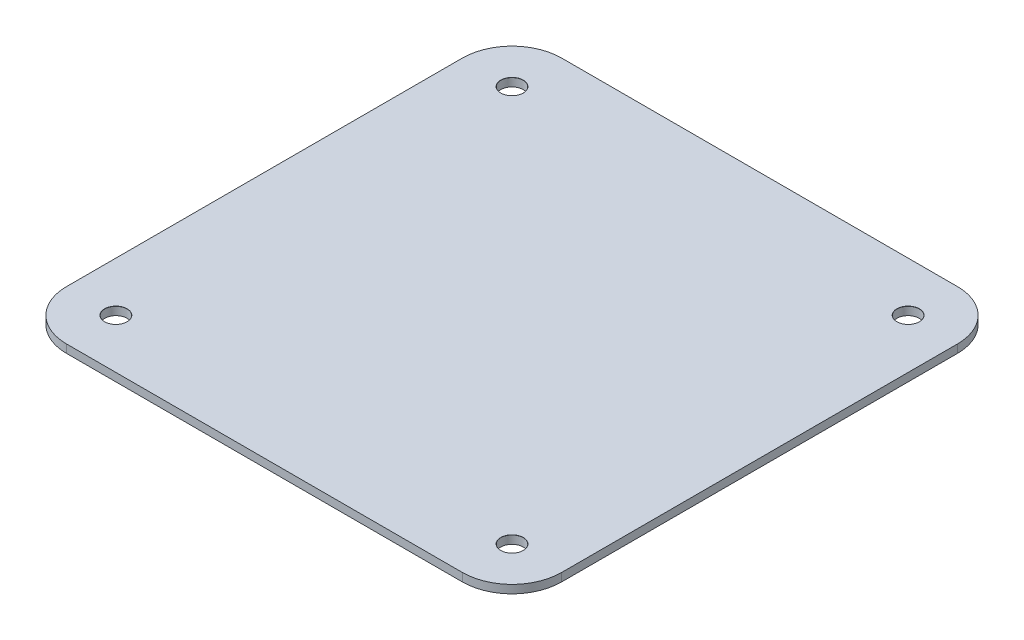
ISO-10303-21;
HEADER;
FILE_DESCRIPTION(('STEP AP214'),'2;1');
FILE_NAME('part.step','',(''),(''),'','','');
FILE_SCHEMA(('AUTOMOTIVE_DESIGN { 1 0 10303 214 1 1 1 1 }'));
ENDSEC;
DATA;
#1=APPLICATION_CONTEXT('core data for automotive mechanical design processes');
#2=APPLICATION_PROTOCOL_DEFINITION('international standard','automotive_design',2000,#1);
#3=PRODUCT_CONTEXT('',#1,'mechanical');
#4=PRODUCT('Part','Part','',(#3));
#5=PRODUCT_RELATED_PRODUCT_CATEGORY('part','',(#4));
#6=PRODUCT_DEFINITION_FORMATION('','',#4);
#7=PRODUCT_DEFINITION_CONTEXT('part definition',#1,'design');
#8=PRODUCT_DEFINITION('design','',#6,#7);
#9=PRODUCT_DEFINITION_SHAPE('','',#8);
#10=(LENGTH_UNIT() NAMED_UNIT(*) SI_UNIT(.MILLI.,.METRE.));
#11=(NAMED_UNIT(*) PLANE_ANGLE_UNIT() SI_UNIT($,.RADIAN.));
#12=(NAMED_UNIT(*) SI_UNIT($,.STERADIAN.) SOLID_ANGLE_UNIT());
#13=UNCERTAINTY_MEASURE_WITH_UNIT(LENGTH_MEASURE(1.E-05),#10,'distance_accuracy_value','');
#14=(GEOMETRIC_REPRESENTATION_CONTEXT(3) GLOBAL_UNCERTAINTY_ASSIGNED_CONTEXT((#13)) GLOBAL_UNIT_ASSIGNED_CONTEXT((#10,
#11,#12)) REPRESENTATION_CONTEXT('',''));
#15=CARTESIAN_POINT('',(0.,0.,0.));
#16=DIRECTION('',(0.,0.,1.));
#17=DIRECTION('',(1.,0.,0.));
#18=AXIS2_PLACEMENT_3D('',#15,#16,#17);
#19=CARTESIAN_POINT('',(50.,1.66,-50.));
#20=DIRECTION('',(-1.,0.,0.));
#21=DIRECTION('',(0.,0.,1.));
#22=AXIS2_PLACEMENT_3D('',#19,#20,#21);
#23=PLANE('',#22);
#24=DIRECTION('',(0.,0.,-1.));
#25=VECTOR('',#24,1.);
#26=CARTESIAN_POINT('',(50.,1.66,-50.));
#27=LINE('',#26,#25);
#28=CARTESIAN_POINT('',(50.,1.66,40.));
#29=VERTEX_POINT('',#28);
#30=CARTESIAN_POINT('',(50.,1.66,-40.));
#31=VERTEX_POINT('',#30);
#32=EDGE_CURVE('E131',#29,#31,#27,.T.);
#33=ORIENTED_EDGE('',*,*,#32,.F.);
#34=DIRECTION('',(0.,-1.,0.));
#35=VECTOR('',#34,1.);
#36=CARTESIAN_POINT('',(50.,1.66,40.));
#37=LINE('',#36,#35);
#38=CARTESIAN_POINT('',(50.,0.,40.));
#39=VERTEX_POINT('',#38);
#40=EDGE_CURVE('E116',#29,#39,#37,.T.);
#41=ORIENTED_EDGE('',*,*,#40,.T.);
#42=DIRECTION('',(0.,0.,-1.));
#43=VECTOR('',#42,1.);
#44=CARTESIAN_POINT('',(50.,0.,-50.));
#45=LINE('',#44,#43);
#46=CARTESIAN_POINT('',(50.,0.,-40.));
#47=VERTEX_POINT('',#46);
#48=EDGE_CURVE('E128',#39,#47,#45,.T.);
#49=ORIENTED_EDGE('',*,*,#48,.T.);
#50=DIRECTION('',(0.,-1.,0.));
#51=VECTOR('',#50,1.);
#52=CARTESIAN_POINT('',(50.,1.66,-40.));
#53=LINE('',#52,#51);
#54=EDGE_CURVE('E133',#47,#31,#53,.F.);
#55=ORIENTED_EDGE('',*,*,#54,.T.);
#56=EDGE_LOOP('',(#33,#41,#49,#55));
#57=FACE_BOUND('',#56,.T.);
#58=ADVANCED_FACE('F44',(#57),#23,.F.);
#59=CARTESIAN_POINT('',(-50.,1.66,-50.));
#60=DIRECTION('',(0.,0.,1.));
#61=DIRECTION('',(1.,0.,0.));
#62=AXIS2_PLACEMENT_3D('',#59,#60,#61);
#63=PLANE('',#62);
#64=DIRECTION('',(-1.,0.,0.));
#65=VECTOR('',#64,1.);
#66=CARTESIAN_POINT('',(-50.,0.,-50.));
#67=LINE('',#66,#65);
#68=CARTESIAN_POINT('',(40.,0.,-50.));
#69=VERTEX_POINT('',#68);
#70=CARTESIAN_POINT('',(-40.,0.,-50.));
#71=VERTEX_POINT('',#70);
#72=EDGE_CURVE('E138',#69,#71,#67,.T.);
#73=ORIENTED_EDGE('',*,*,#72,.T.);
#74=DIRECTION('',(0.,-1.,0.));
#75=VECTOR('',#74,1.);
#76=CARTESIAN_POINT('',(-40.,1.66,-50.));
#77=LINE('',#76,#75);
#78=CARTESIAN_POINT('',(-40.,1.66,-50.));
#79=VERTEX_POINT('',#78);
#80=EDGE_CURVE('E12',#71,#79,#77,.F.);
#81=ORIENTED_EDGE('',*,*,#80,.T.);
#82=DIRECTION('',(-1.,0.,0.));
#83=VECTOR('',#82,1.);
#84=CARTESIAN_POINT('',(-50.,1.66,-50.));
#85=LINE('',#84,#83);
#86=CARTESIAN_POINT('',(40.,1.66,-50.));
#87=VERTEX_POINT('',#86);
#88=EDGE_CURVE('E178',#87,#79,#85,.T.);
#89=ORIENTED_EDGE('',*,*,#88,.F.);
#90=DIRECTION('',(0.,-1.,0.));
#91=VECTOR('',#90,1.);
#92=CARTESIAN_POINT('',(40.,1.66,-50.));
#93=LINE('',#92,#91);
#94=EDGE_CURVE('E53',#87,#69,#93,.T.);
#95=ORIENTED_EDGE('',*,*,#94,.T.);
#96=EDGE_LOOP('',(#73,#81,#89,#95));
#97=FACE_BOUND('',#96,.T.);
#98=ADVANCED_FACE('F244',(#97),#63,.F.);
#99=CARTESIAN_POINT('',(-50.,1.66,-50.));
#100=DIRECTION('',(1.,0.,0.));
#101=DIRECTION('',(0.,0.,-1.));
#102=AXIS2_PLACEMENT_3D('',#99,#100,#101);
#103=PLANE('',#102);
#104=DIRECTION('',(0.,0.,1.));
#105=VECTOR('',#104,1.);
#106=CARTESIAN_POINT('',(-50.,1.66,-50.));
#107=LINE('',#106,#105);
#108=CARTESIAN_POINT('',(-50.,1.66,-40.));
#109=VERTEX_POINT('',#108);
#110=CARTESIAN_POINT('',(-50.,1.66,40.));
#111=VERTEX_POINT('',#110);
#112=EDGE_CURVE('E181',#109,#111,#107,.T.);
#113=ORIENTED_EDGE('',*,*,#112,.F.);
#114=DIRECTION('',(0.,-1.,0.));
#115=VECTOR('',#114,1.);
#116=CARTESIAN_POINT('',(-50.,1.66,-40.));
#117=LINE('',#116,#115);
#118=CARTESIAN_POINT('',(-50.,0.,-40.));
#119=VERTEX_POINT('',#118);
#120=EDGE_CURVE('E198',#109,#119,#117,.T.);
#121=ORIENTED_EDGE('',*,*,#120,.T.);
#122=DIRECTION('',(0.,0.,1.));
#123=VECTOR('',#122,1.);
#124=CARTESIAN_POINT('',(-50.,0.,-50.));
#125=LINE('',#124,#123);
#126=CARTESIAN_POINT('',(-50.,0.,40.));
#127=VERTEX_POINT('',#126);
#128=EDGE_CURVE('E142',#119,#127,#125,.T.);
#129=ORIENTED_EDGE('',*,*,#128,.T.);
#130=DIRECTION('',(0.,-1.,0.));
#131=VECTOR('',#130,1.);
#132=CARTESIAN_POINT('',(-50.,1.66,40.));
#133=LINE('',#132,#131);
#134=EDGE_CURVE('E61',#127,#111,#133,.F.);
#135=ORIENTED_EDGE('',*,*,#134,.T.);
#136=EDGE_LOOP('',(#113,#121,#129,#135));
#137=FACE_BOUND('',#136,.T.);
#138=ADVANCED_FACE('F238',(#137),#103,.F.);
#139=CARTESIAN_POINT('',(-50.,1.66,50.));
#140=DIRECTION('',(0.,0.,-1.));
#141=DIRECTION('',(-1.,0.,0.));
#142=AXIS2_PLACEMENT_3D('',#139,#140,#141);
#143=PLANE('',#142);
#144=DIRECTION('',(1.,0.,0.));
#145=VECTOR('',#144,1.);
#146=CARTESIAN_POINT('',(-50.,0.,50.));
#147=LINE('',#146,#145);
#148=CARTESIAN_POINT('',(-40.,0.,50.));
#149=VERTEX_POINT('',#148);
#150=CARTESIAN_POINT('',(40.,0.,50.));
#151=VERTEX_POINT('',#150);
#152=EDGE_CURVE('E153',#149,#151,#147,.T.);
#153=ORIENTED_EDGE('',*,*,#152,.T.);
#154=DIRECTION('',(0.,-1.,0.));
#155=VECTOR('',#154,1.);
#156=CARTESIAN_POINT('',(40.,1.66,50.));
#157=LINE('',#156,#155);
#158=CARTESIAN_POINT('',(40.,1.66,50.));
#159=VERTEX_POINT('',#158);
#160=EDGE_CURVE('E117',#151,#159,#157,.F.);
#161=ORIENTED_EDGE('',*,*,#160,.T.);
#162=DIRECTION('',(1.,0.,0.));
#163=VECTOR('',#162,1.);
#164=CARTESIAN_POINT('',(-50.,1.66,50.));
#165=LINE('',#164,#163);
#166=CARTESIAN_POINT('',(-40.,1.66,50.));
#167=VERTEX_POINT('',#166);
#168=EDGE_CURVE('E148',#167,#159,#165,.T.);
#169=ORIENTED_EDGE('',*,*,#168,.F.);
#170=DIRECTION('',(0.,-1.,0.));
#171=VECTOR('',#170,1.);
#172=CARTESIAN_POINT('',(-40.,1.66,50.));
#173=LINE('',#172,#171);
#174=EDGE_CURVE('E122',#167,#149,#173,.T.);
#175=ORIENTED_EDGE('',*,*,#174,.T.);
#176=EDGE_LOOP('',(#153,#161,#169,#175));
#177=FACE_BOUND('',#176,.T.);
#178=ADVANCED_FACE('F228',(#177),#143,.F.);
#179=CARTESIAN_POINT('',(0.,1.66,0.));
#180=DIRECTION('',(0.,1.,0.));
#181=DIRECTION('',(0.,0.,1.));
#182=AXIS2_PLACEMENT_3D('',#179,#180,#181);
#183=PLANE('',#182);
#184=CARTESIAN_POINT('',(-40.,1.66,-40.));
#185=DIRECTION('',(0.,1.,0.));
#186=DIRECTION('',(0.,0.,1.));
#187=AXIS2_PLACEMENT_3D('',#184,#185,#186);
#188=CIRCLE('',#187,2.275);
#189=CARTESIAN_POINT('',(-40.,1.66,-37.725));
#190=VERTEX_POINT('',#189);
#191=EDGE_CURVE('E297',#190,#190,#188,.T.);
#192=ORIENTED_EDGE('',*,*,#191,.F.);
#193=EDGE_LOOP('',(#192));
#194=FACE_BOUND('',#193,.T.);
#195=CARTESIAN_POINT('',(-40.,1.66,40.));
#196=DIRECTION('',(0.,1.,0.));
#197=DIRECTION('',(0.,0.,1.));
#198=AXIS2_PLACEMENT_3D('',#195,#196,#197);
#199=CIRCLE('',#198,2.275);
#200=CARTESIAN_POINT('',(-40.,1.66,42.275));
#201=VERTEX_POINT('',#200);
#202=EDGE_CURVE('E284',#201,#201,#199,.T.);
#203=ORIENTED_EDGE('',*,*,#202,.F.);
#204=EDGE_LOOP('',(#203));
#205=FACE_BOUND('',#204,.T.);
#206=CARTESIAN_POINT('',(40.,1.66,40.));
#207=DIRECTION('',(0.,1.,0.));
#208=DIRECTION('',(0.,0.,1.));
#209=AXIS2_PLACEMENT_3D('',#206,#207,#208);
#210=CIRCLE('',#209,2.275);
#211=CARTESIAN_POINT('',(40.,1.66,42.275));
#212=VERTEX_POINT('',#211);
#213=EDGE_CURVE('E277',#212,#212,#210,.T.);
#214=ORIENTED_EDGE('',*,*,#213,.F.);
#215=EDGE_LOOP('',(#214));
#216=FACE_BOUND('',#215,.T.);
#217=CARTESIAN_POINT('',(40.,1.66,-40.));
#218=DIRECTION('',(0.,1.,0.));
#219=DIRECTION('',(0.,0.,1.));
#220=AXIS2_PLACEMENT_3D('',#217,#218,#219);
#221=CIRCLE('',#220,2.275);
#222=CARTESIAN_POINT('',(40.,1.66,-37.725));
#223=VERTEX_POINT('',#222);
#224=EDGE_CURVE('E208',#223,#223,#221,.T.);
#225=ORIENTED_EDGE('',*,*,#224,.F.);
#226=EDGE_LOOP('',(#225));
#227=FACE_BOUND('',#226,.T.);
#228=ORIENTED_EDGE('',*,*,#168,.T.);
#229=CARTESIAN_POINT('',(40.,1.66,40.));
#230=DIRECTION('',(0.,1.,0.));
#231=DIRECTION('',(0.,0.,1.));
#232=AXIS2_PLACEMENT_3D('',#229,#230,#231);
#233=CIRCLE('',#232,10.);
#234=EDGE_CURVE('E194',#159,#29,#233,.T.);
#235=ORIENTED_EDGE('',*,*,#234,.T.);
#236=ORIENTED_EDGE('',*,*,#32,.T.);
#237=CARTESIAN_POINT('',(40.,1.66,-40.));
#238=DIRECTION('',(0.,1.,0.));
#239=DIRECTION('',(0.,0.,1.));
#240=AXIS2_PLACEMENT_3D('',#237,#238,#239);
#241=CIRCLE('',#240,10.);
#242=EDGE_CURVE('E165',#31,#87,#241,.T.);
#243=ORIENTED_EDGE('',*,*,#242,.T.);
#244=ORIENTED_EDGE('',*,*,#88,.T.);
#245=CARTESIAN_POINT('',(-40.,1.66,-40.));
#246=DIRECTION('',(0.,1.,0.));
#247=DIRECTION('',(0.,0.,1.));
#248=AXIS2_PLACEMENT_3D('',#245,#246,#247);
#249=CIRCLE('',#248,10.);
#250=EDGE_CURVE('E68',#79,#109,#249,.T.);
#251=ORIENTED_EDGE('',*,*,#250,.T.);
#252=ORIENTED_EDGE('',*,*,#112,.T.);
#253=CARTESIAN_POINT('',(-40.,1.66,40.));
#254=DIRECTION('',(0.,1.,0.));
#255=DIRECTION('',(0.,0.,1.));
#256=AXIS2_PLACEMENT_3D('',#253,#254,#255);
#257=CIRCLE('',#256,10.);
#258=EDGE_CURVE('E161',#111,#167,#257,.T.);
#259=ORIENTED_EDGE('',*,*,#258,.T.);
#260=EDGE_LOOP('',(#228,#235,#236,#243,#244,#251,#252,#259));
#261=FACE_BOUND('',#260,.T.);
#262=ADVANCED_FACE('F193',(#194,#205,#216,#227,#261),#183,.T.);
#263=CARTESIAN_POINT('',(0.,0.,0.));
#264=DIRECTION('',(0.,1.,0.));
#265=DIRECTION('',(0.,0.,1.));
#266=AXIS2_PLACEMENT_3D('',#263,#264,#265);
#267=PLANE('',#266);
#268=CARTESIAN_POINT('',(-40.,0.,-40.));
#269=DIRECTION('',(0.,1.,0.));
#270=DIRECTION('',(0.,0.,1.));
#271=AXIS2_PLACEMENT_3D('',#268,#269,#270);
#272=CIRCLE('',#271,2.25);
#273=CARTESIAN_POINT('',(-40.,0.,-37.75));
#274=VERTEX_POINT('',#273);
#275=EDGE_CURVE('E48',#274,#274,#272,.T.);
#276=ORIENTED_EDGE('',*,*,#275,.T.);
#277=EDGE_LOOP('',(#276));
#278=FACE_BOUND('',#277,.T.);
#279=CARTESIAN_POINT('',(-40.,0.,40.));
#280=DIRECTION('',(0.,1.,0.));
#281=DIRECTION('',(0.,0.,1.));
#282=AXIS2_PLACEMENT_3D('',#279,#280,#281);
#283=CIRCLE('',#282,2.25);
#284=CARTESIAN_POINT('',(-40.,0.,42.25));
#285=VERTEX_POINT('',#284);
#286=EDGE_CURVE('E275',#285,#285,#283,.T.);
#287=ORIENTED_EDGE('',*,*,#286,.T.);
#288=EDGE_LOOP('',(#287));
#289=FACE_BOUND('',#288,.T.);
#290=CARTESIAN_POINT('',(40.,0.,40.));
#291=DIRECTION('',(0.,1.,0.));
#292=DIRECTION('',(0.,0.,1.));
#293=AXIS2_PLACEMENT_3D('',#290,#291,#292);
#294=CIRCLE('',#293,2.25);
#295=CARTESIAN_POINT('',(40.,0.,42.25));
#296=VERTEX_POINT('',#295);
#297=EDGE_CURVE('E212',#296,#296,#294,.T.);
#298=ORIENTED_EDGE('',*,*,#297,.T.);
#299=EDGE_LOOP('',(#298));
#300=FACE_BOUND('',#299,.T.);
#301=CARTESIAN_POINT('',(40.,0.,-40.));
#302=DIRECTION('',(0.,1.,0.));
#303=DIRECTION('',(0.,0.,1.));
#304=AXIS2_PLACEMENT_3D('',#301,#302,#303);
#305=CIRCLE('',#304,2.25);
#306=CARTESIAN_POINT('',(40.,0.,-37.75));
#307=VERTEX_POINT('',#306);
#308=EDGE_CURVE('E139',#307,#307,#305,.T.);
#309=ORIENTED_EDGE('',*,*,#308,.T.);
#310=EDGE_LOOP('',(#309));
#311=FACE_BOUND('',#310,.T.);
#312=ORIENTED_EDGE('',*,*,#48,.F.);
#313=CARTESIAN_POINT('',(40.,0.,40.));
#314=DIRECTION('',(0.,1.,0.));
#315=DIRECTION('',(0.,0.,1.));
#316=AXIS2_PLACEMENT_3D('',#313,#314,#315);
#317=CIRCLE('',#316,10.);
#318=EDGE_CURVE('E112',#39,#151,#317,.F.);
#319=ORIENTED_EDGE('',*,*,#318,.T.);
#320=ORIENTED_EDGE('',*,*,#152,.F.);
#321=CARTESIAN_POINT('',(-40.,0.,40.));
#322=DIRECTION('',(0.,1.,0.));
#323=DIRECTION('',(0.,0.,1.));
#324=AXIS2_PLACEMENT_3D('',#321,#322,#323);
#325=CIRCLE('',#324,10.);
#326=EDGE_CURVE('E132',#149,#127,#325,.F.);
#327=ORIENTED_EDGE('',*,*,#326,.T.);
#328=ORIENTED_EDGE('',*,*,#128,.F.);
#329=CARTESIAN_POINT('',(-40.,0.,-40.));
#330=DIRECTION('',(0.,1.,0.));
#331=DIRECTION('',(0.,0.,1.));
#332=AXIS2_PLACEMENT_3D('',#329,#330,#331);
#333=CIRCLE('',#332,10.);
#334=EDGE_CURVE('E123',#119,#71,#333,.F.);
#335=ORIENTED_EDGE('',*,*,#334,.T.);
#336=ORIENTED_EDGE('',*,*,#72,.F.);
#337=CARTESIAN_POINT('',(40.,0.,-40.));
#338=DIRECTION('',(0.,1.,0.));
#339=DIRECTION('',(0.,0.,1.));
#340=AXIS2_PLACEMENT_3D('',#337,#338,#339);
#341=CIRCLE('',#340,10.);
#342=EDGE_CURVE('E137',#69,#47,#341,.F.);
#343=ORIENTED_EDGE('',*,*,#342,.T.);
#344=EDGE_LOOP('',(#312,#319,#320,#327,#328,#335,#336,#343));
#345=FACE_BOUND('',#344,.T.);
#346=ADVANCED_FACE('F135',(#278,#289,#300,#311,#345),#267,.F.);
#347=CARTESIAN_POINT('',(40.,1.66,40.));
#348=DIRECTION('',(0.,-1.,0.));
#349=DIRECTION('',(0.,0.,-1.));
#350=AXIS2_PLACEMENT_3D('',#347,#348,#349);
#351=CYLINDRICAL_SURFACE('',#350,10.);
#352=ORIENTED_EDGE('',*,*,#234,.F.);
#353=ORIENTED_EDGE('',*,*,#160,.F.);
#354=ORIENTED_EDGE('',*,*,#318,.F.);
#355=ORIENTED_EDGE('',*,*,#40,.F.);
#356=EDGE_LOOP('',(#352,#353,#354,#355));
#357=FACE_BOUND('',#356,.T.);
#358=ADVANCED_FACE('F115',(#357),#351,.T.);
#359=CARTESIAN_POINT('',(-40.,1.66,-40.));
#360=DIRECTION('',(0.,-1.,0.));
#361=DIRECTION('',(0.,0.,-1.));
#362=AXIS2_PLACEMENT_3D('',#359,#360,#361);
#363=CYLINDRICAL_SURFACE('',#362,10.);
#364=ORIENTED_EDGE('',*,*,#250,.F.);
#365=ORIENTED_EDGE('',*,*,#80,.F.);
#366=ORIENTED_EDGE('',*,*,#334,.F.);
#367=ORIENTED_EDGE('',*,*,#120,.F.);
#368=EDGE_LOOP('',(#364,#365,#366,#367));
#369=FACE_BOUND('',#368,.T.);
#370=ADVANCED_FACE('F255',(#369),#363,.T.);
#371=CARTESIAN_POINT('',(40.,1.66,-40.));
#372=DIRECTION('',(0.,-1.,0.));
#373=DIRECTION('',(0.,0.,-1.));
#374=AXIS2_PLACEMENT_3D('',#371,#372,#373);
#375=CYLINDRICAL_SURFACE('',#374,10.);
#376=ORIENTED_EDGE('',*,*,#242,.F.);
#377=ORIENTED_EDGE('',*,*,#54,.F.);
#378=ORIENTED_EDGE('',*,*,#342,.F.);
#379=ORIENTED_EDGE('',*,*,#94,.F.);
#380=EDGE_LOOP('',(#376,#377,#378,#379));
#381=FACE_BOUND('',#380,.T.);
#382=ADVANCED_FACE('F257',(#381),#375,.T.);
#383=CARTESIAN_POINT('',(-40.,1.66,40.));
#384=DIRECTION('',(0.,-1.,0.));
#385=DIRECTION('',(0.,0.,-1.));
#386=AXIS2_PLACEMENT_3D('',#383,#384,#385);
#387=CYLINDRICAL_SURFACE('',#386,10.);
#388=ORIENTED_EDGE('',*,*,#258,.F.);
#389=ORIENTED_EDGE('',*,*,#134,.F.);
#390=ORIENTED_EDGE('',*,*,#326,.F.);
#391=ORIENTED_EDGE('',*,*,#174,.F.);
#392=EDGE_LOOP('',(#388,#389,#390,#391));
#393=FACE_BOUND('',#392,.T.);
#394=ADVANCED_FACE('F46',(#393),#387,.T.);
#395=CARTESIAN_POINT('',(40.,1.66,-40.));
#396=DIRECTION('',(0.,1.,0.));
#397=DIRECTION('',(0.,0.,1.));
#398=AXIS2_PLACEMENT_3D('',#395,#396,#397);
#399=CYLINDRICAL_SURFACE('',#398,2.25);
#400=CARTESIAN_POINT('',(40.,1.635,-40.));
#401=DIRECTION('',(0.,1.,0.));
#402=DIRECTION('',(0.,0.,1.));
#403=AXIS2_PLACEMENT_3D('',#400,#401,#402);
#404=CIRCLE('',#403,2.25);
#405=CARTESIAN_POINT('',(40.,1.635,-37.75));
#406=VERTEX_POINT('',#405);
#407=EDGE_CURVE('E145',#406,#406,#404,.T.);
#408=ORIENTED_EDGE('',*,*,#407,.T.);
#409=EDGE_LOOP('',(#408));
#410=FACE_BOUND('',#409,.T.);
#411=ORIENTED_EDGE('',*,*,#308,.F.);
#412=EDGE_LOOP('',(#411));
#413=FACE_BOUND('',#412,.T.);
#414=ADVANCED_FACE('F217',(#410,#413),#399,.F.);
#415=CARTESIAN_POINT('',(40.,1.66,-40.));
#416=DIRECTION('',(0.,1.,0.));
#417=DIRECTION('',(0.,0.,1.));
#418=AXIS2_PLACEMENT_3D('',#415,#416,#417);
#419=CONICAL_SURFACE('',#418,2.275,0.785398163397518);
#420=ORIENTED_EDGE('',*,*,#407,.F.);
#421=EDGE_LOOP('',(#420));
#422=FACE_BOUND('',#421,.T.);
#423=ORIENTED_EDGE('',*,*,#224,.T.);
#424=EDGE_LOOP('',(#423));
#425=FACE_BOUND('',#424,.T.);
#426=ADVANCED_FACE('F220',(#422,#425),#419,.F.);
#427=CARTESIAN_POINT('',(40.,1.66,40.));
#428=DIRECTION('',(0.,1.,0.));
#429=DIRECTION('',(0.,0.,1.));
#430=AXIS2_PLACEMENT_3D('',#427,#428,#429);
#431=CYLINDRICAL_SURFACE('',#430,2.25);
#432=CARTESIAN_POINT('',(40.,1.635,40.));
#433=DIRECTION('',(0.,1.,0.));
#434=DIRECTION('',(0.,0.,1.));
#435=AXIS2_PLACEMENT_3D('',#432,#433,#434);
#436=CIRCLE('',#435,2.25);
#437=CARTESIAN_POINT('',(40.,1.635,42.25));
#438=VERTEX_POINT('',#437);
#439=EDGE_CURVE('E213',#438,#438,#436,.T.);
#440=ORIENTED_EDGE('',*,*,#439,.T.);
#441=EDGE_LOOP('',(#440));
#442=FACE_BOUND('',#441,.T.);
#443=ORIENTED_EDGE('',*,*,#297,.F.);
#444=EDGE_LOOP('',(#443));
#445=FACE_BOUND('',#444,.T.);
#446=ADVANCED_FACE('F223',(#442,#445),#431,.F.);
#447=CARTESIAN_POINT('',(40.,1.66,40.));
#448=DIRECTION('',(0.,1.,0.));
#449=DIRECTION('',(0.,0.,1.));
#450=AXIS2_PLACEMENT_3D('',#447,#448,#449);
#451=CONICAL_SURFACE('',#450,2.275,0.785398163397518);
#452=ORIENTED_EDGE('',*,*,#439,.F.);
#453=EDGE_LOOP('',(#452));
#454=FACE_BOUND('',#453,.T.);
#455=ORIENTED_EDGE('',*,*,#213,.T.);
#456=EDGE_LOOP('',(#455));
#457=FACE_BOUND('',#456,.T.);
#458=ADVANCED_FACE('F325',(#454,#457),#451,.F.);
#459=CARTESIAN_POINT('',(-40.,1.66,40.));
#460=DIRECTION('',(0.,1.,0.));
#461=DIRECTION('',(0.,0.,1.));
#462=AXIS2_PLACEMENT_3D('',#459,#460,#461);
#463=CYLINDRICAL_SURFACE('',#462,2.25);
#464=CARTESIAN_POINT('',(-40.,1.635,40.));
#465=DIRECTION('',(0.,1.,0.));
#466=DIRECTION('',(0.,0.,1.));
#467=AXIS2_PLACEMENT_3D('',#464,#465,#466);
#468=CIRCLE('',#467,2.25);
#469=CARTESIAN_POINT('',(-40.,1.635,42.25));
#470=VERTEX_POINT('',#469);
#471=EDGE_CURVE('E278',#470,#470,#468,.T.);
#472=ORIENTED_EDGE('',*,*,#471,.T.);
#473=EDGE_LOOP('',(#472));
#474=FACE_BOUND('',#473,.T.);
#475=ORIENTED_EDGE('',*,*,#286,.F.);
#476=EDGE_LOOP('',(#475));
#477=FACE_BOUND('',#476,.T.);
#478=ADVANCED_FACE('F319',(#474,#477),#463,.F.);
#479=CARTESIAN_POINT('',(-40.,1.66,40.));
#480=DIRECTION('',(0.,1.,0.));
#481=DIRECTION('',(0.,0.,1.));
#482=AXIS2_PLACEMENT_3D('',#479,#480,#481);
#483=CONICAL_SURFACE('',#482,2.275,0.785398163397518);
#484=ORIENTED_EDGE('',*,*,#471,.F.);
#485=EDGE_LOOP('',(#484));
#486=FACE_BOUND('',#485,.T.);
#487=ORIENTED_EDGE('',*,*,#202,.T.);
#488=EDGE_LOOP('',(#487));
#489=FACE_BOUND('',#488,.T.);
#490=ADVANCED_FACE('F311',(#486,#489),#483,.F.);
#491=CARTESIAN_POINT('',(-40.,1.66,-40.));
#492=DIRECTION('',(0.,1.,0.));
#493=DIRECTION('',(0.,0.,1.));
#494=AXIS2_PLACEMENT_3D('',#491,#492,#493);
#495=CYLINDRICAL_SURFACE('',#494,2.25);
#496=CARTESIAN_POINT('',(-40.,1.635,-40.));
#497=DIRECTION('',(0.,1.,0.));
#498=DIRECTION('',(0.,0.,1.));
#499=AXIS2_PLACEMENT_3D('',#496,#497,#498);
#500=CIRCLE('',#499,2.25);
#501=CARTESIAN_POINT('',(-40.,1.635,-37.75));
#502=VERTEX_POINT('',#501);
#503=EDGE_CURVE('E294',#502,#502,#500,.T.);
#504=ORIENTED_EDGE('',*,*,#503,.T.);
#505=EDGE_LOOP('',(#504));
#506=FACE_BOUND('',#505,.T.);
#507=ORIENTED_EDGE('',*,*,#275,.F.);
#508=EDGE_LOOP('',(#507));
#509=FACE_BOUND('',#508,.T.);
#510=ADVANCED_FACE('F308',(#506,#509),#495,.F.);
#511=CARTESIAN_POINT('',(-40.,1.66,-40.));
#512=DIRECTION('',(0.,1.,0.));
#513=DIRECTION('',(0.,0.,1.));
#514=AXIS2_PLACEMENT_3D('',#511,#512,#513);
#515=CONICAL_SURFACE('',#514,2.275,0.785398163397518);
#516=ORIENTED_EDGE('',*,*,#503,.F.);
#517=EDGE_LOOP('',(#516));
#518=FACE_BOUND('',#517,.T.);
#519=ORIENTED_EDGE('',*,*,#191,.T.);
#520=EDGE_LOOP('',(#519));
#521=FACE_BOUND('',#520,.T.);
#522=ADVANCED_FACE('F310',(#518,#521),#515,.F.);
#523=CLOSED_SHELL('',(#58,#98,#138,#178,#262,#346,#358,#370,#382,#394,#414,#426,#446,#458,#478,
#490,#510,#522));
#524=MANIFOLD_SOLID_BREP('B2',#523);
#525=ADVANCED_BREP_SHAPE_REPRESENTATION('',(#18,#524),#14);
#526=SHAPE_DEFINITION_REPRESENTATION(#9,#525);
ENDSEC;
END-ISO-10303-21;
